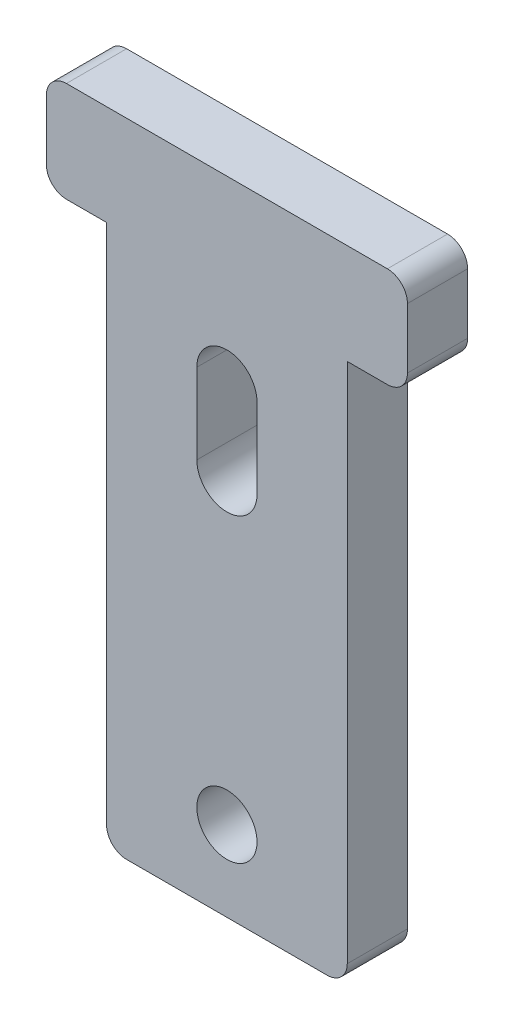
ISO-10303-21;
HEADER;
FILE_DESCRIPTION(('STEP AP214'),'2;1');
FILE_NAME('part.step','',(''),(''),'','','');
FILE_SCHEMA(('AUTOMOTIVE_DESIGN { 1 0 10303 214 1 1 1 1 }'));
ENDSEC;
DATA;
#1=APPLICATION_CONTEXT('core data for automotive mechanical design processes');
#2=APPLICATION_PROTOCOL_DEFINITION('international standard','automotive_design',2000,#1);
#3=PRODUCT_CONTEXT('',#1,'mechanical');
#4=PRODUCT('Part','Part','',(#3));
#5=PRODUCT_RELATED_PRODUCT_CATEGORY('part','',(#4));
#6=PRODUCT_DEFINITION_FORMATION('','',#4);
#7=PRODUCT_DEFINITION_CONTEXT('part definition',#1,'design');
#8=PRODUCT_DEFINITION('design','',#6,#7);
#9=PRODUCT_DEFINITION_SHAPE('','',#8);
#10=(LENGTH_UNIT() NAMED_UNIT(*) SI_UNIT(.MILLI.,.METRE.));
#11=(NAMED_UNIT(*) PLANE_ANGLE_UNIT() SI_UNIT($,.RADIAN.));
#12=(NAMED_UNIT(*) SI_UNIT($,.STERADIAN.) SOLID_ANGLE_UNIT());
#13=UNCERTAINTY_MEASURE_WITH_UNIT(LENGTH_MEASURE(1.E-05),#10,'distance_accuracy_value','');
#14=(GEOMETRIC_REPRESENTATION_CONTEXT(3) GLOBAL_UNCERTAINTY_ASSIGNED_CONTEXT((#13)) GLOBAL_UNIT_ASSIGNED_CONTEXT((#10,
#11,#12)) REPRESENTATION_CONTEXT('',''));
#15=CARTESIAN_POINT('',(0.,0.,0.));
#16=DIRECTION('',(0.,0.,1.));
#17=DIRECTION('',(1.,0.,0.));
#18=AXIS2_PLACEMENT_3D('',#15,#16,#17);
#19=CARTESIAN_POINT('',(6.,0.,3.));
#20=DIRECTION('',(-1.,0.,0.));
#21=DIRECTION('',(0.,0.,1.));
#22=AXIS2_PLACEMENT_3D('',#19,#20,#21);
#23=PLANE('',#22);
#24=DIRECTION('',(0.,1.,0.));
#25=VECTOR('',#24,1.);
#26=CARTESIAN_POINT('',(6.,0.,3.));
#27=LINE('',#26,#25);
#28=CARTESIAN_POINT('',(6.,1.,3.));
#29=VERTEX_POINT('',#28);
#30=CARTESIAN_POINT('',(6.,27.,3.));
#31=VERTEX_POINT('',#30);
#32=EDGE_CURVE('E221',#29,#31,#27,.T.);
#33=ORIENTED_EDGE('',*,*,#32,.F.);
#34=DIRECTION('',(0.,0.,-1.));
#35=VECTOR('',#34,1.);
#36=CARTESIAN_POINT('',(6.,1.,0.));
#37=LINE('',#36,#35);
#38=CARTESIAN_POINT('',(6.,1.,0.));
#39=VERTEX_POINT('',#38);
#40=EDGE_CURVE('E11',#29,#39,#37,.T.);
#41=ORIENTED_EDGE('',*,*,#40,.T.);
#42=DIRECTION('',(0.,1.,0.));
#43=VECTOR('',#42,1.);
#44=CARTESIAN_POINT('',(6.,0.,0.));
#45=LINE('',#44,#43);
#46=CARTESIAN_POINT('',(6.,27.,0.));
#47=VERTEX_POINT('',#46);
#48=EDGE_CURVE('E217',#39,#47,#45,.T.);
#49=ORIENTED_EDGE('',*,*,#48,.T.);
#50=DIRECTION('',(0.,0.,-1.));
#51=VECTOR('',#50,1.);
#52=CARTESIAN_POINT('',(6.,27.,3.));
#53=LINE('',#52,#51);
#54=EDGE_CURVE('E284',#31,#47,#53,.T.);
#55=ORIENTED_EDGE('',*,*,#54,.F.);
#56=EDGE_LOOP('',(#33,#41,#49,#55));
#57=FACE_BOUND('',#56,.T.);
#58=ADVANCED_FACE('F39',(#57),#23,.F.);
#59=CARTESIAN_POINT('',(6.,27.,3.));
#60=DIRECTION('',(0.,1.,0.));
#61=DIRECTION('',(0.,0.,1.));
#62=AXIS2_PLACEMENT_3D('',#59,#60,#61);
#63=PLANE('',#62);
#64=DIRECTION('',(1.,0.,0.));
#65=VECTOR('',#64,1.);
#66=CARTESIAN_POINT('',(6.,27.,0.));
#67=LINE('',#66,#65);
#68=CARTESIAN_POINT('',(8.,27.,0.));
#69=VERTEX_POINT('',#68);
#70=EDGE_CURVE('E255',#47,#69,#67,.T.);
#71=ORIENTED_EDGE('',*,*,#70,.T.);
#72=DIRECTION('',(0.,0.,-1.));
#73=VECTOR('',#72,1.);
#74=CARTESIAN_POINT('',(8.,27.,3.));
#75=LINE('',#74,#73);
#76=CARTESIAN_POINT('',(8.,27.,3.));
#77=VERTEX_POINT('',#76);
#78=EDGE_CURVE('E345',#69,#77,#75,.F.);
#79=ORIENTED_EDGE('',*,*,#78,.T.);
#80=DIRECTION('',(1.,0.,0.));
#81=VECTOR('',#80,1.);
#82=CARTESIAN_POINT('',(6.,27.,3.));
#83=LINE('',#82,#81);
#84=EDGE_CURVE('E224',#31,#77,#83,.T.);
#85=ORIENTED_EDGE('',*,*,#84,.F.);
#86=ORIENTED_EDGE('',*,*,#54,.T.);
#87=EDGE_LOOP('',(#71,#79,#85,#86));
#88=FACE_BOUND('',#87,.T.);
#89=ADVANCED_FACE('F390',(#88),#63,.F.);
#90=CARTESIAN_POINT('',(9.,27.,3.));
#91=DIRECTION('',(-1.,0.,0.));
#92=DIRECTION('',(0.,-1.,0.));
#93=AXIS2_PLACEMENT_3D('',#90,#91,#92);
#94=PLANE('',#93);
#95=DIRECTION('',(0.,1.,0.));
#96=VECTOR('',#95,1.);
#97=CARTESIAN_POINT('',(9.,27.,0.));
#98=LINE('',#97,#96);
#99=CARTESIAN_POINT('',(9.,28.,0.));
#100=VERTEX_POINT('',#99);
#101=CARTESIAN_POINT('',(9.,31.,0.));
#102=VERTEX_POINT('',#101);
#103=EDGE_CURVE('E259',#100,#102,#98,.T.);
#104=ORIENTED_EDGE('',*,*,#103,.T.);
#105=DIRECTION('',(0.,0.,-1.));
#106=VECTOR('',#105,1.);
#107=CARTESIAN_POINT('',(9.,31.,3.));
#108=LINE('',#107,#106);
#109=CARTESIAN_POINT('',(9.,31.,3.));
#110=VERTEX_POINT('',#109);
#111=EDGE_CURVE('E342',#102,#110,#108,.F.);
#112=ORIENTED_EDGE('',*,*,#111,.T.);
#113=DIRECTION('',(0.,1.,0.));
#114=VECTOR('',#113,1.);
#115=CARTESIAN_POINT('',(9.,27.,3.));
#116=LINE('',#115,#114);
#117=CARTESIAN_POINT('',(9.,28.,3.));
#118=VERTEX_POINT('',#117);
#119=EDGE_CURVE('E229',#118,#110,#116,.T.);
#120=ORIENTED_EDGE('',*,*,#119,.F.);
#121=DIRECTION('',(0.,0.,-1.));
#122=VECTOR('',#121,1.);
#123=CARTESIAN_POINT('',(9.,28.,3.));
#124=LINE('',#123,#122);
#125=EDGE_CURVE('E338',#118,#100,#124,.T.);
#126=ORIENTED_EDGE('',*,*,#125,.T.);
#127=EDGE_LOOP('',(#104,#112,#120,#126));
#128=FACE_BOUND('',#127,.T.);
#129=ADVANCED_FACE('F398',(#128),#94,.F.);
#130=CARTESIAN_POINT('',(-9.,32.,3.));
#131=DIRECTION('',(0.,1.,0.));
#132=DIRECTION('',(0.,0.,1.));
#133=AXIS2_PLACEMENT_3D('',#130,#131,#132);
#134=PLANE('',#133);
#135=DIRECTION('',(1.,0.,0.));
#136=VECTOR('',#135,1.);
#137=CARTESIAN_POINT('',(-9.,32.,0.));
#138=LINE('',#137,#136);
#139=CARTESIAN_POINT('',(-8.,32.,0.));
#140=VERTEX_POINT('',#139);
#141=CARTESIAN_POINT('',(8.,32.,0.));
#142=VERTEX_POINT('',#141);
#143=EDGE_CURVE('E263',#140,#142,#138,.T.);
#144=ORIENTED_EDGE('',*,*,#143,.F.);
#145=DIRECTION('',(0.,0.,-1.));
#146=VECTOR('',#145,1.);
#147=CARTESIAN_POINT('',(-8.,32.,3.));
#148=LINE('',#147,#146);
#149=CARTESIAN_POINT('',(-8.,32.,3.));
#150=VERTEX_POINT('',#149);
#151=EDGE_CURVE('E317',#140,#150,#148,.F.);
#152=ORIENTED_EDGE('',*,*,#151,.T.);
#153=DIRECTION('',(1.,0.,0.));
#154=VECTOR('',#153,1.);
#155=CARTESIAN_POINT('',(-9.,32.,3.));
#156=LINE('',#155,#154);
#157=CARTESIAN_POINT('',(8.,32.,3.));
#158=VERTEX_POINT('',#157);
#159=EDGE_CURVE('E233',#150,#158,#156,.T.);
#160=ORIENTED_EDGE('',*,*,#159,.T.);
#161=DIRECTION('',(0.,0.,-1.));
#162=VECTOR('',#161,1.);
#163=CARTESIAN_POINT('',(8.,32.,0.));
#164=LINE('',#163,#162);
#165=EDGE_CURVE('E313',#158,#142,#164,.T.);
#166=ORIENTED_EDGE('',*,*,#165,.T.);
#167=EDGE_LOOP('',(#144,#152,#160,#166));
#168=FACE_BOUND('',#167,.T.);
#169=ADVANCED_FACE('F407',(#168),#134,.T.);
#170=CARTESIAN_POINT('',(-9.,27.,3.));
#171=DIRECTION('',(-1.,0.,0.));
#172=DIRECTION('',(0.,-1.,0.));
#173=AXIS2_PLACEMENT_3D('',#170,#171,#172);
#174=PLANE('',#173);
#175=DIRECTION('',(0.,1.,0.));
#176=VECTOR('',#175,1.);
#177=CARTESIAN_POINT('',(-9.,27.,3.));
#178=LINE('',#177,#176);
#179=CARTESIAN_POINT('',(-9.,28.,3.));
#180=VERTEX_POINT('',#179);
#181=CARTESIAN_POINT('',(-9.,31.,3.));
#182=VERTEX_POINT('',#181);
#183=EDGE_CURVE('E237',#180,#182,#178,.T.);
#184=ORIENTED_EDGE('',*,*,#183,.T.);
#185=DIRECTION('',(0.,0.,-1.));
#186=VECTOR('',#185,1.);
#187=CARTESIAN_POINT('',(-9.,31.,3.));
#188=LINE('',#187,#186);
#189=CARTESIAN_POINT('',(-9.,31.,0.));
#190=VERTEX_POINT('',#189);
#191=EDGE_CURVE('E291',#182,#190,#188,.T.);
#192=ORIENTED_EDGE('',*,*,#191,.T.);
#193=DIRECTION('',(0.,1.,0.));
#194=VECTOR('',#193,1.);
#195=CARTESIAN_POINT('',(-9.,27.,0.));
#196=LINE('',#195,#194);
#197=CARTESIAN_POINT('',(-9.,28.,0.));
#198=VERTEX_POINT('',#197);
#199=EDGE_CURVE('E267',#198,#190,#196,.T.);
#200=ORIENTED_EDGE('',*,*,#199,.F.);
#201=DIRECTION('',(0.,0.,-1.));
#202=VECTOR('',#201,1.);
#203=CARTESIAN_POINT('',(-9.,28.,3.));
#204=LINE('',#203,#202);
#205=EDGE_CURVE('E288',#198,#180,#204,.F.);
#206=ORIENTED_EDGE('',*,*,#205,.T.);
#207=EDGE_LOOP('',(#184,#192,#200,#206));
#208=FACE_BOUND('',#207,.T.);
#209=ADVANCED_FACE('F415',(#208),#174,.T.);
#210=CARTESIAN_POINT('',(-6.,27.,3.));
#211=DIRECTION('',(0.,-1.,0.));
#212=DIRECTION('',(0.,0.,-1.));
#213=AXIS2_PLACEMENT_3D('',#210,#211,#212);
#214=PLANE('',#213);
#215=DIRECTION('',(-1.,0.,0.));
#216=VECTOR('',#215,1.);
#217=CARTESIAN_POINT('',(-6.,27.,3.));
#218=LINE('',#217,#216);
#219=CARTESIAN_POINT('',(-6.,27.,3.));
#220=VERTEX_POINT('',#219);
#221=CARTESIAN_POINT('',(-8.,27.,3.));
#222=VERTEX_POINT('',#221);
#223=EDGE_CURVE('E241',#220,#222,#218,.T.);
#224=ORIENTED_EDGE('',*,*,#223,.T.);
#225=DIRECTION('',(0.,0.,-1.));
#226=VECTOR('',#225,1.);
#227=CARTESIAN_POINT('',(-8.,27.,3.));
#228=LINE('',#227,#226);
#229=CARTESIAN_POINT('',(-8.,27.,0.));
#230=VERTEX_POINT('',#229);
#231=EDGE_CURVE('E348',#222,#230,#228,.T.);
#232=ORIENTED_EDGE('',*,*,#231,.T.);
#233=DIRECTION('',(-1.,0.,0.));
#234=VECTOR('',#233,1.);
#235=CARTESIAN_POINT('',(-6.,27.,0.));
#236=LINE('',#235,#234);
#237=CARTESIAN_POINT('',(-6.,27.,0.));
#238=VERTEX_POINT('',#237);
#239=EDGE_CURVE('E271',#238,#230,#236,.T.);
#240=ORIENTED_EDGE('',*,*,#239,.F.);
#241=DIRECTION('',(0.,0.,-1.));
#242=VECTOR('',#241,1.);
#243=CARTESIAN_POINT('',(-6.,27.,3.));
#244=LINE('',#243,#242);
#245=EDGE_CURVE('E252',#220,#238,#244,.T.);
#246=ORIENTED_EDGE('',*,*,#245,.F.);
#247=EDGE_LOOP('',(#224,#232,#240,#246));
#248=FACE_BOUND('',#247,.T.);
#249=ADVANCED_FACE('F422',(#248),#214,.T.);
#250=CARTESIAN_POINT('',(-6.,0.,3.));
#251=DIRECTION('',(-1.,0.,0.));
#252=DIRECTION('',(0.,0.,1.));
#253=AXIS2_PLACEMENT_3D('',#250,#251,#252);
#254=PLANE('',#253);
#255=DIRECTION('',(0.,1.,0.));
#256=VECTOR('',#255,1.);
#257=CARTESIAN_POINT('',(-6.,0.,0.));
#258=LINE('',#257,#256);
#259=CARTESIAN_POINT('',(-6.,1.,0.));
#260=VERTEX_POINT('',#259);
#261=EDGE_CURVE('E275',#260,#238,#258,.T.);
#262=ORIENTED_EDGE('',*,*,#261,.F.);
#263=DIRECTION('',(0.,0.,-1.));
#264=VECTOR('',#263,1.);
#265=CARTESIAN_POINT('',(-6.,1.,3.));
#266=LINE('',#265,#264);
#267=CARTESIAN_POINT('',(-6.,1.,3.));
#268=VERTEX_POINT('',#267);
#269=EDGE_CURVE('E48',#260,#268,#266,.F.);
#270=ORIENTED_EDGE('',*,*,#269,.T.);
#271=DIRECTION('',(0.,1.,0.));
#272=VECTOR('',#271,1.);
#273=CARTESIAN_POINT('',(-6.,0.,3.));
#274=LINE('',#273,#272);
#275=EDGE_CURVE('E245',#268,#220,#274,.T.);
#276=ORIENTED_EDGE('',*,*,#275,.T.);
#277=ORIENTED_EDGE('',*,*,#245,.T.);
#278=EDGE_LOOP('',(#262,#270,#276,#277));
#279=FACE_BOUND('',#278,.T.);
#280=ADVANCED_FACE('F363',(#279),#254,.T.);
#281=CARTESIAN_POINT('',(6.,0.,3.));
#282=DIRECTION('',(0.,-1.,0.));
#283=DIRECTION('',(0.,0.,-1.));
#284=AXIS2_PLACEMENT_3D('',#281,#282,#283);
#285=PLANE('',#284);
#286=DIRECTION('',(-1.,0.,0.));
#287=VECTOR('',#286,1.);
#288=CARTESIAN_POINT('',(6.,0.,3.));
#289=LINE('',#288,#287);
#290=CARTESIAN_POINT('',(5.,0.,3.));
#291=VERTEX_POINT('',#290);
#292=CARTESIAN_POINT('',(-5.,0.,3.));
#293=VERTEX_POINT('',#292);
#294=EDGE_CURVE('E248',#291,#293,#289,.T.);
#295=ORIENTED_EDGE('',*,*,#294,.T.);
#296=DIRECTION('',(0.,0.,-1.));
#297=VECTOR('',#296,1.);
#298=CARTESIAN_POINT('',(-5.,0.,3.));
#299=LINE('',#298,#297);
#300=CARTESIAN_POINT('',(-5.,0.,0.));
#301=VERTEX_POINT('',#300);
#302=EDGE_CURVE('E355',#293,#301,#299,.T.);
#303=ORIENTED_EDGE('',*,*,#302,.T.);
#304=DIRECTION('',(-1.,0.,0.));
#305=VECTOR('',#304,1.);
#306=CARTESIAN_POINT('',(6.,0.,0.));
#307=LINE('',#306,#305);
#308=CARTESIAN_POINT('',(5.,0.,0.));
#309=VERTEX_POINT('',#308);
#310=EDGE_CURVE('E225',#309,#301,#307,.T.);
#311=ORIENTED_EDGE('',*,*,#310,.F.);
#312=DIRECTION('',(0.,0.,-1.));
#313=VECTOR('',#312,1.);
#314=CARTESIAN_POINT('',(5.,0.,3.));
#315=LINE('',#314,#313);
#316=EDGE_CURVE('E352',#309,#291,#315,.F.);
#317=ORIENTED_EDGE('',*,*,#316,.T.);
#318=EDGE_LOOP('',(#295,#303,#311,#317));
#319=FACE_BOUND('',#318,.T.);
#320=ADVANCED_FACE('F376',(#319),#285,.T.);
#321=CARTESIAN_POINT('',(0.,0.,3.));
#322=DIRECTION('',(0.,0.,-1.));
#323=DIRECTION('',(-1.,0.,0.));
#324=AXIS2_PLACEMENT_3D('',#321,#322,#323);
#325=PLANE('',#324);
#326=CARTESIAN_POINT('',(0.,19.,3.));
#327=DIRECTION('',(0.,0.,1.));
#328=DIRECTION('',(1.,0.,0.));
#329=AXIS2_PLACEMENT_3D('',#326,#327,#328);
#330=CIRCLE('',#329,1.5);
#331=CARTESIAN_POINT('',(-1.5,19.,3.));
#332=VERTEX_POINT('',#331);
#333=CARTESIAN_POINT('',(1.5,19.,3.));
#334=VERTEX_POINT('',#333);
#335=EDGE_CURVE('E198',#332,#334,#330,.T.);
#336=ORIENTED_EDGE('',*,*,#335,.F.);
#337=DIRECTION('',(0.,-1.,0.));
#338=VECTOR('',#337,1.);
#339=CARTESIAN_POINT('',(-1.5,23.,3.));
#340=LINE('',#339,#338);
#341=CARTESIAN_POINT('',(-1.5,23.,3.));
#342=VERTEX_POINT('',#341);
#343=EDGE_CURVE('E55',#342,#332,#340,.T.);
#344=ORIENTED_EDGE('',*,*,#343,.F.);
#345=CARTESIAN_POINT('',(0.,23.,3.));
#346=DIRECTION('',(0.,0.,1.));
#347=DIRECTION('',(1.,0.,0.));
#348=AXIS2_PLACEMENT_3D('',#345,#346,#347);
#349=CIRCLE('',#348,1.5);
#350=CARTESIAN_POINT('',(1.5,23.,3.));
#351=VERTEX_POINT('',#350);
#352=EDGE_CURVE('E185',#351,#342,#349,.T.);
#353=ORIENTED_EDGE('',*,*,#352,.F.);
#354=DIRECTION('',(0.,-1.,0.));
#355=VECTOR('',#354,1.);
#356=CARTESIAN_POINT('',(1.5,23.,3.));
#357=LINE('',#356,#355);
#358=EDGE_CURVE('E189',#351,#334,#357,.T.);
#359=ORIENTED_EDGE('',*,*,#358,.T.);
#360=EDGE_LOOP('',(#336,#344,#353,#359));
#361=FACE_BOUND('',#360,.T.);
#362=CARTESIAN_POINT('',(0.,4.,3.));
#363=DIRECTION('',(0.,0.,1.));
#364=DIRECTION('',(1.,0.,0.));
#365=AXIS2_PLACEMENT_3D('',#362,#363,#364);
#366=CIRCLE('',#365,1.5);
#367=CARTESIAN_POINT('',(1.5,4.,3.));
#368=VERTEX_POINT('',#367);
#369=EDGE_CURVE('E207',#368,#368,#366,.T.);
#370=ORIENTED_EDGE('',*,*,#369,.F.);
#371=EDGE_LOOP('',(#370));
#372=FACE_BOUND('',#371,.T.);
#373=ORIENTED_EDGE('',*,*,#159,.F.);
#374=CARTESIAN_POINT('',(-8.,31.,3.));
#375=DIRECTION('',(0.,0.,-1.));
#376=DIRECTION('',(-1.,0.,0.));
#377=AXIS2_PLACEMENT_3D('',#374,#375,#376);
#378=CIRCLE('',#377,1.);
#379=EDGE_CURVE('E335',#150,#182,#378,.F.);
#380=ORIENTED_EDGE('',*,*,#379,.T.);
#381=ORIENTED_EDGE('',*,*,#183,.F.);
#382=CARTESIAN_POINT('',(-8.,28.,3.));
#383=DIRECTION('',(0.,0.,-1.));
#384=DIRECTION('',(-1.,0.,0.));
#385=AXIS2_PLACEMENT_3D('',#382,#383,#384);
#386=CIRCLE('',#385,1.);
#387=EDGE_CURVE('E326',#180,#222,#386,.F.);
#388=ORIENTED_EDGE('',*,*,#387,.T.);
#389=ORIENTED_EDGE('',*,*,#223,.F.);
#390=ORIENTED_EDGE('',*,*,#275,.F.);
#391=CARTESIAN_POINT('',(-5.,1.,3.));
#392=DIRECTION('',(0.,0.,-1.));
#393=DIRECTION('',(-1.,0.,0.));
#394=AXIS2_PLACEMENT_3D('',#391,#392,#393);
#395=CIRCLE('',#394,1.);
#396=EDGE_CURVE('E323',#268,#293,#395,.F.);
#397=ORIENTED_EDGE('',*,*,#396,.T.);
#398=ORIENTED_EDGE('',*,*,#294,.F.);
#399=CARTESIAN_POINT('',(5.,1.,3.));
#400=DIRECTION('',(0.,0.,-1.));
#401=DIRECTION('',(-1.,0.,0.));
#402=AXIS2_PLACEMENT_3D('',#399,#400,#401);
#403=CIRCLE('',#402,1.);
#404=EDGE_CURVE('E320',#291,#29,#403,.F.);
#405=ORIENTED_EDGE('',*,*,#404,.T.);
#406=ORIENTED_EDGE('',*,*,#32,.T.);
#407=ORIENTED_EDGE('',*,*,#84,.T.);
#408=CARTESIAN_POINT('',(8.,28.,3.));
#409=DIRECTION('',(0.,0.,-1.));
#410=DIRECTION('',(-1.,0.,0.));
#411=AXIS2_PLACEMENT_3D('',#408,#409,#410);
#412=CIRCLE('',#411,1.);
#413=EDGE_CURVE('E329',#77,#118,#412,.F.);
#414=ORIENTED_EDGE('',*,*,#413,.T.);
#415=ORIENTED_EDGE('',*,*,#119,.T.);
#416=CARTESIAN_POINT('',(8.,31.,3.));
#417=DIRECTION('',(0.,0.,-1.));
#418=DIRECTION('',(-1.,0.,0.));
#419=AXIS2_PLACEMENT_3D('',#416,#417,#418);
#420=CIRCLE('',#419,1.);
#421=EDGE_CURVE('E332',#110,#158,#420,.F.);
#422=ORIENTED_EDGE('',*,*,#421,.T.);
#423=EDGE_LOOP('',(#373,#380,#381,#388,#389,#390,#397,#398,#405,#406,#407,#414,#415,#422));
#424=FACE_BOUND('',#423,.T.);
#425=ADVANCED_FACE('F370',(#361,#372,#424),#325,.F.);
#426=CARTESIAN_POINT('',(0.,0.,0.));
#427=DIRECTION('',(0.,0.,-1.));
#428=DIRECTION('',(-1.,0.,0.));
#429=AXIS2_PLACEMENT_3D('',#426,#427,#428);
#430=PLANE('',#429);
#431=DIRECTION('',(0.,-1.,0.));
#432=VECTOR('',#431,1.);
#433=CARTESIAN_POINT('',(-1.5,23.,0.));
#434=LINE('',#433,#432);
#435=CARTESIAN_POINT('',(-1.5,23.,0.));
#436=VERTEX_POINT('',#435);
#437=CARTESIAN_POINT('',(-1.5,19.,0.));
#438=VERTEX_POINT('',#437);
#439=EDGE_CURVE('E167',#436,#438,#434,.T.);
#440=ORIENTED_EDGE('',*,*,#439,.T.);
#441=CARTESIAN_POINT('',(0.,19.,0.));
#442=DIRECTION('',(0.,0.,1.));
#443=DIRECTION('',(1.,0.,0.));
#444=AXIS2_PLACEMENT_3D('',#441,#442,#443);
#445=CIRCLE('',#444,1.5);
#446=CARTESIAN_POINT('',(1.5,19.,0.));
#447=VERTEX_POINT('',#446);
#448=EDGE_CURVE('E174',#438,#447,#445,.T.);
#449=ORIENTED_EDGE('',*,*,#448,.T.);
#450=DIRECTION('',(0.,-1.,0.));
#451=VECTOR('',#450,1.);
#452=CARTESIAN_POINT('',(1.5,23.,0.));
#453=LINE('',#452,#451);
#454=CARTESIAN_POINT('',(1.5,23.,0.));
#455=VERTEX_POINT('',#454);
#456=EDGE_CURVE('E179',#455,#447,#453,.T.);
#457=ORIENTED_EDGE('',*,*,#456,.F.);
#458=CARTESIAN_POINT('',(0.,23.,0.));
#459=DIRECTION('',(0.,0.,1.));
#460=DIRECTION('',(1.,0.,0.));
#461=AXIS2_PLACEMENT_3D('',#458,#459,#460);
#462=CIRCLE('',#461,1.5);
#463=EDGE_CURVE('E171',#455,#436,#462,.T.);
#464=ORIENTED_EDGE('',*,*,#463,.T.);
#465=EDGE_LOOP('',(#440,#449,#457,#464));
#466=FACE_BOUND('',#465,.T.);
#467=CARTESIAN_POINT('',(0.,4.,0.));
#468=DIRECTION('',(0.,0.,1.));
#469=DIRECTION('',(1.,0.,0.));
#470=AXIS2_PLACEMENT_3D('',#467,#468,#469);
#471=CIRCLE('',#470,1.5);
#472=CARTESIAN_POINT('',(1.5,4.,0.));
#473=VERTEX_POINT('',#472);
#474=EDGE_CURVE('E213',#473,#473,#471,.T.);
#475=ORIENTED_EDGE('',*,*,#474,.T.);
#476=EDGE_LOOP('',(#475));
#477=FACE_BOUND('',#476,.T.);
#478=ORIENTED_EDGE('',*,*,#199,.T.);
#479=CARTESIAN_POINT('',(-8.,31.,0.));
#480=DIRECTION('',(0.,0.,-1.));
#481=DIRECTION('',(-1.,0.,0.));
#482=AXIS2_PLACEMENT_3D('',#479,#480,#481);
#483=CIRCLE('',#482,1.);
#484=EDGE_CURVE('E310',#190,#140,#483,.T.);
#485=ORIENTED_EDGE('',*,*,#484,.T.);
#486=ORIENTED_EDGE('',*,*,#143,.T.);
#487=CARTESIAN_POINT('',(8.,31.,0.));
#488=DIRECTION('',(0.,0.,-1.));
#489=DIRECTION('',(-1.,0.,0.));
#490=AXIS2_PLACEMENT_3D('',#487,#488,#489);
#491=CIRCLE('',#490,1.);
#492=EDGE_CURVE('E307',#142,#102,#491,.T.);
#493=ORIENTED_EDGE('',*,*,#492,.T.);
#494=ORIENTED_EDGE('',*,*,#103,.F.);
#495=CARTESIAN_POINT('',(8.,28.,0.));
#496=DIRECTION('',(0.,0.,-1.));
#497=DIRECTION('',(-1.,0.,0.));
#498=AXIS2_PLACEMENT_3D('',#495,#496,#497);
#499=CIRCLE('',#498,1.);
#500=EDGE_CURVE('E304',#100,#69,#499,.T.);
#501=ORIENTED_EDGE('',*,*,#500,.T.);
#502=ORIENTED_EDGE('',*,*,#70,.F.);
#503=ORIENTED_EDGE('',*,*,#48,.F.);
#504=CARTESIAN_POINT('',(5.,1.,0.));
#505=DIRECTION('',(0.,0.,-1.));
#506=DIRECTION('',(-1.,0.,0.));
#507=AXIS2_PLACEMENT_3D('',#504,#505,#506);
#508=CIRCLE('',#507,1.);
#509=EDGE_CURVE('E295',#39,#309,#508,.T.);
#510=ORIENTED_EDGE('',*,*,#509,.T.);
#511=ORIENTED_EDGE('',*,*,#310,.T.);
#512=CARTESIAN_POINT('',(-5.,1.,0.));
#513=DIRECTION('',(0.,0.,-1.));
#514=DIRECTION('',(-1.,0.,0.));
#515=AXIS2_PLACEMENT_3D('',#512,#513,#514);
#516=CIRCLE('',#515,1.);
#517=EDGE_CURVE('E298',#301,#260,#516,.T.);
#518=ORIENTED_EDGE('',*,*,#517,.T.);
#519=ORIENTED_EDGE('',*,*,#261,.T.);
#520=ORIENTED_EDGE('',*,*,#239,.T.);
#521=CARTESIAN_POINT('',(-8.,28.,0.));
#522=DIRECTION('',(0.,0.,-1.));
#523=DIRECTION('',(-1.,0.,0.));
#524=AXIS2_PLACEMENT_3D('',#521,#522,#523);
#525=CIRCLE('',#524,1.);
#526=EDGE_CURVE('E301',#230,#198,#525,.T.);
#527=ORIENTED_EDGE('',*,*,#526,.T.);
#528=EDGE_LOOP('',(#478,#485,#486,#493,#494,#501,#502,#503,#510,#511,#518,#519,#520,#527));
#529=FACE_BOUND('',#528,.T.);
#530=ADVANCED_FACE('F181',(#466,#477,#529),#430,.T.);
#531=CARTESIAN_POINT('',(0.,4.,0.));
#532=DIRECTION('',(0.,0.,1.));
#533=DIRECTION('',(1.,0.,0.));
#534=AXIS2_PLACEMENT_3D('',#531,#532,#533);
#535=CYLINDRICAL_SURFACE('',#534,1.5);
#536=ORIENTED_EDGE('',*,*,#474,.F.);
#537=EDGE_LOOP('',(#536));
#538=FACE_BOUND('',#537,.T.);
#539=ORIENTED_EDGE('',*,*,#369,.T.);
#540=EDGE_LOOP('',(#539));
#541=FACE_BOUND('',#540,.T.);
#542=ADVANCED_FACE('F442',(#538,#541),#535,.F.);
#543=CARTESIAN_POINT('',(-8.,31.,3.));
#544=DIRECTION('',(0.,0.,-1.));
#545=DIRECTION('',(-1.,0.,0.));
#546=AXIS2_PLACEMENT_3D('',#543,#544,#545);
#547=CYLINDRICAL_SURFACE('',#546,1.);
#548=ORIENTED_EDGE('',*,*,#379,.F.);
#549=ORIENTED_EDGE('',*,*,#151,.F.);
#550=ORIENTED_EDGE('',*,*,#484,.F.);
#551=ORIENTED_EDGE('',*,*,#191,.F.);
#552=EDGE_LOOP('',(#548,#549,#550,#551));
#553=FACE_BOUND('',#552,.T.);
#554=ADVANCED_FACE('F410',(#553),#547,.T.);
#555=CARTESIAN_POINT('',(8.,31.,3.));
#556=DIRECTION('',(0.,0.,1.));
#557=DIRECTION('',(1.,0.,0.));
#558=AXIS2_PLACEMENT_3D('',#555,#556,#557);
#559=CYLINDRICAL_SURFACE('',#558,1.);
#560=ORIENTED_EDGE('',*,*,#421,.F.);
#561=ORIENTED_EDGE('',*,*,#111,.F.);
#562=ORIENTED_EDGE('',*,*,#492,.F.);
#563=ORIENTED_EDGE('',*,*,#165,.F.);
#564=EDGE_LOOP('',(#560,#561,#562,#563));
#565=FACE_BOUND('',#564,.T.);
#566=ADVANCED_FACE('F402',(#565),#559,.T.);
#567=CARTESIAN_POINT('',(8.,28.,3.));
#568=DIRECTION('',(0.,0.,-1.));
#569=DIRECTION('',(-1.,0.,0.));
#570=AXIS2_PLACEMENT_3D('',#567,#568,#569);
#571=CYLINDRICAL_SURFACE('',#570,1.);
#572=ORIENTED_EDGE('',*,*,#413,.F.);
#573=ORIENTED_EDGE('',*,*,#78,.F.);
#574=ORIENTED_EDGE('',*,*,#500,.F.);
#575=ORIENTED_EDGE('',*,*,#125,.F.);
#576=EDGE_LOOP('',(#572,#573,#574,#575));
#577=FACE_BOUND('',#576,.T.);
#578=ADVANCED_FACE('F393',(#577),#571,.T.);
#579=CARTESIAN_POINT('',(-8.,28.,3.));
#580=DIRECTION('',(0.,0.,-1.));
#581=DIRECTION('',(-1.,0.,0.));
#582=AXIS2_PLACEMENT_3D('',#579,#580,#581);
#583=CYLINDRICAL_SURFACE('',#582,1.);
#584=ORIENTED_EDGE('',*,*,#387,.F.);
#585=ORIENTED_EDGE('',*,*,#205,.F.);
#586=ORIENTED_EDGE('',*,*,#526,.F.);
#587=ORIENTED_EDGE('',*,*,#231,.F.);
#588=EDGE_LOOP('',(#584,#585,#586,#587));
#589=FACE_BOUND('',#588,.T.);
#590=ADVANCED_FACE('F419',(#589),#583,.T.);
#591=CARTESIAN_POINT('',(-5.,1.,3.));
#592=DIRECTION('',(0.,0.,-1.));
#593=DIRECTION('',(-1.,0.,0.));
#594=AXIS2_PLACEMENT_3D('',#591,#592,#593);
#595=CYLINDRICAL_SURFACE('',#594,1.);
#596=ORIENTED_EDGE('',*,*,#396,.F.);
#597=ORIENTED_EDGE('',*,*,#269,.F.);
#598=ORIENTED_EDGE('',*,*,#517,.F.);
#599=ORIENTED_EDGE('',*,*,#302,.F.);
#600=EDGE_LOOP('',(#596,#597,#598,#599));
#601=FACE_BOUND('',#600,.T.);
#602=ADVANCED_FACE('F373',(#601),#595,.T.);
#603=CARTESIAN_POINT('',(5.,1.,3.));
#604=DIRECTION('',(0.,0.,1.));
#605=DIRECTION('',(1.,0.,0.));
#606=AXIS2_PLACEMENT_3D('',#603,#604,#605);
#607=CYLINDRICAL_SURFACE('',#606,1.);
#608=ORIENTED_EDGE('',*,*,#404,.F.);
#609=ORIENTED_EDGE('',*,*,#316,.F.);
#610=ORIENTED_EDGE('',*,*,#509,.F.);
#611=ORIENTED_EDGE('',*,*,#40,.F.);
#612=EDGE_LOOP('',(#608,#609,#610,#611));
#613=FACE_BOUND('',#612,.T.);
#614=ADVANCED_FACE('F41',(#613),#607,.T.);
#615=CARTESIAN_POINT('',(-1.5,23.,0.));
#616=DIRECTION('',(-1.,0.,0.));
#617=DIRECTION('',(0.,-1.,0.));
#618=AXIS2_PLACEMENT_3D('',#615,#616,#617);
#619=PLANE('',#618);
#620=ORIENTED_EDGE('',*,*,#343,.T.);
#621=DIRECTION('',(0.,0.,1.));
#622=VECTOR('',#621,1.);
#623=CARTESIAN_POINT('',(-1.5,19.,0.));
#624=LINE('',#623,#622);
#625=EDGE_CURVE('E164',#438,#332,#624,.T.);
#626=ORIENTED_EDGE('',*,*,#625,.F.);
#627=ORIENTED_EDGE('',*,*,#439,.F.);
#628=DIRECTION('',(0.,0.,1.));
#629=VECTOR('',#628,1.);
#630=CARTESIAN_POINT('',(-1.5,23.,0.));
#631=LINE('',#630,#629);
#632=EDGE_CURVE('E204',#436,#342,#631,.T.);
#633=ORIENTED_EDGE('',*,*,#632,.T.);
#634=EDGE_LOOP('',(#620,#626,#627,#633));
#635=FACE_BOUND('',#634,.T.);
#636=ADVANCED_FACE('F165',(#635),#619,.F.);
#637=CARTESIAN_POINT('',(0.,23.,0.));
#638=DIRECTION('',(0.,0.,1.));
#639=DIRECTION('',(1.,0.,0.));
#640=AXIS2_PLACEMENT_3D('',#637,#638,#639);
#641=CYLINDRICAL_SURFACE('',#640,1.5);
#642=ORIENTED_EDGE('',*,*,#352,.T.);
#643=ORIENTED_EDGE('',*,*,#632,.F.);
#644=ORIENTED_EDGE('',*,*,#463,.F.);
#645=DIRECTION('',(0.,0.,1.));
#646=VECTOR('',#645,1.);
#647=CARTESIAN_POINT('',(1.5,23.,0.));
#648=LINE('',#647,#646);
#649=EDGE_CURVE('E208',#455,#351,#648,.T.);
#650=ORIENTED_EDGE('',*,*,#649,.T.);
#651=EDGE_LOOP('',(#642,#643,#644,#650));
#652=FACE_BOUND('',#651,.T.);
#653=ADVANCED_FACE('F455',(#652),#641,.F.);
#654=CARTESIAN_POINT('',(1.5,23.,0.));
#655=DIRECTION('',(-1.,0.,0.));
#656=DIRECTION('',(0.,-1.,0.));
#657=AXIS2_PLACEMENT_3D('',#654,#655,#656);
#658=PLANE('',#657);
#659=ORIENTED_EDGE('',*,*,#358,.F.);
#660=ORIENTED_EDGE('',*,*,#649,.F.);
#661=ORIENTED_EDGE('',*,*,#456,.T.);
#662=DIRECTION('',(0.,0.,1.));
#663=VECTOR('',#662,1.);
#664=CARTESIAN_POINT('',(1.5,19.,0.));
#665=LINE('',#664,#663);
#666=EDGE_CURVE('E63',#447,#334,#665,.T.);
#667=ORIENTED_EDGE('',*,*,#666,.T.);
#668=EDGE_LOOP('',(#659,#660,#661,#667));
#669=FACE_BOUND('',#668,.T.);
#670=ADVANCED_FACE('F460',(#669),#658,.T.);
#671=CARTESIAN_POINT('',(0.,19.,0.));
#672=DIRECTION('',(0.,0.,1.));
#673=DIRECTION('',(1.,0.,0.));
#674=AXIS2_PLACEMENT_3D('',#671,#672,#673);
#675=CYLINDRICAL_SURFACE('',#674,1.5);
#676=ORIENTED_EDGE('',*,*,#335,.T.);
#677=ORIENTED_EDGE('',*,*,#666,.F.);
#678=ORIENTED_EDGE('',*,*,#448,.F.);
#679=ORIENTED_EDGE('',*,*,#625,.T.);
#680=EDGE_LOOP('',(#676,#677,#678,#679));
#681=FACE_BOUND('',#680,.T.);
#682=ADVANCED_FACE('F175',(#681),#675,.F.);
#683=CLOSED_SHELL('',(#58,#89,#129,#169,#209,#249,#280,#320,#425,#530,#542,#554,#566,#578,#590,
#602,#614,#636,#653,#670,#682));
#684=MANIFOLD_SOLID_BREP('B2',#683);
#685=ADVANCED_BREP_SHAPE_REPRESENTATION('',(#18,#684),#14);
#686=SHAPE_DEFINITION_REPRESENTATION(#9,#685);
ENDSEC;
END-ISO-10303-21;
